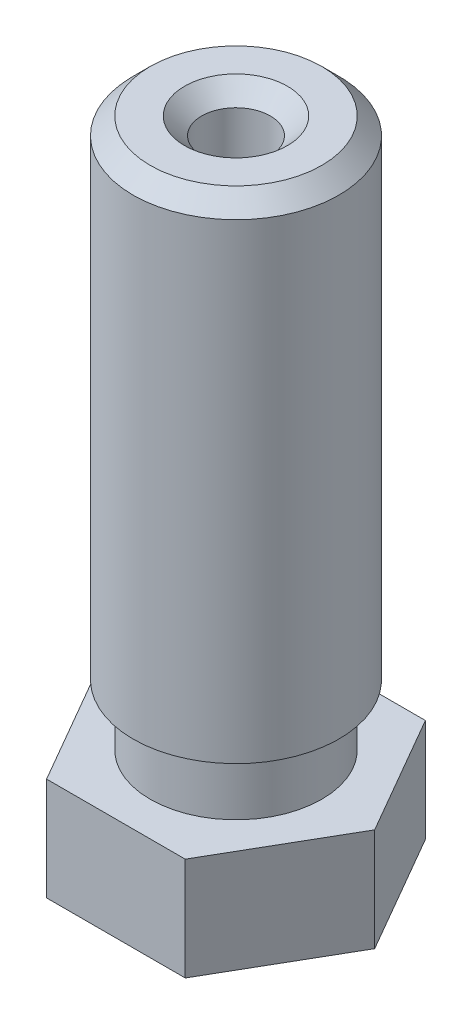
ISO-10303-21;
HEADER;
FILE_DESCRIPTION(('STEP AP214'),'2;1');
FILE_NAME('part.step','',(''),(''),'','','');
FILE_SCHEMA(('AUTOMOTIVE_DESIGN { 1 0 10303 214 1 1 1 1 }'));
ENDSEC;
DATA;
#1=APPLICATION_CONTEXT('core data for automotive mechanical design processes');
#2=APPLICATION_PROTOCOL_DEFINITION('international standard','automotive_design',2000,#1);
#3=PRODUCT_CONTEXT('',#1,'mechanical');
#4=PRODUCT('Part','Part','',(#3));
#5=PRODUCT_RELATED_PRODUCT_CATEGORY('part','',(#4));
#6=PRODUCT_DEFINITION_FORMATION('','',#4);
#7=PRODUCT_DEFINITION_CONTEXT('part definition',#1,'design');
#8=PRODUCT_DEFINITION('design','',#6,#7);
#9=PRODUCT_DEFINITION_SHAPE('','',#8);
#10=(LENGTH_UNIT() NAMED_UNIT(*) SI_UNIT(.MILLI.,.METRE.));
#11=(NAMED_UNIT(*) PLANE_ANGLE_UNIT() SI_UNIT($,.RADIAN.));
#12=(NAMED_UNIT(*) SI_UNIT($,.STERADIAN.) SOLID_ANGLE_UNIT());
#13=UNCERTAINTY_MEASURE_WITH_UNIT(LENGTH_MEASURE(1.E-05),#10,'distance_accuracy_value','');
#14=(GEOMETRIC_REPRESENTATION_CONTEXT(3) GLOBAL_UNCERTAINTY_ASSIGNED_CONTEXT((#13)) GLOBAL_UNIT_ASSIGNED_CONTEXT((#10,
#11,#12)) REPRESENTATION_CONTEXT('',''));
#15=CARTESIAN_POINT('',(0.,0.,0.));
#16=DIRECTION('',(0.,0.,1.));
#17=DIRECTION('',(1.,0.,0.));
#18=AXIS2_PLACEMENT_3D('',#15,#16,#17);
#19=CARTESIAN_POINT('',(0.,21.,0.));
#20=DIRECTION('',(0.,1.,0.));
#21=DIRECTION('',(0.,0.,1.));
#22=AXIS2_PLACEMENT_3D('',#19,#20,#21);
#23=PLANE('',#22);
#24=CARTESIAN_POINT('',(0.,21.,0.));
#25=DIRECTION('',(0.,1.,0.));
#26=DIRECTION('',(0.,0.,1.));
#27=AXIS2_PLACEMENT_3D('',#24,#25,#26);
#28=CIRCLE('',#27,2.5);
#29=CARTESIAN_POINT('',(0.,21.,2.5));
#30=VERTEX_POINT('',#29);
#31=EDGE_CURVE('E41',#30,#30,#28,.T.);
#32=ORIENTED_EDGE('',*,*,#31,.T.);
#33=EDGE_LOOP('',(#32));
#34=FACE_BOUND('',#33,.T.);
#35=CARTESIAN_POINT('',(0.,21.,0.));
#36=DIRECTION('',(0.,1.,0.));
#37=DIRECTION('',(0.,0.,1.));
#38=AXIS2_PLACEMENT_3D('',#35,#36,#37);
#39=CIRCLE('',#38,1.5);
#40=CARTESIAN_POINT('',(0.,21.,1.5));
#41=VERTEX_POINT('',#40);
#42=EDGE_CURVE('E125',#41,#41,#39,.F.);
#43=ORIENTED_EDGE('',*,*,#42,.T.);
#44=EDGE_LOOP('',(#43));
#45=FACE_BOUND('',#44,.T.);
#46=ADVANCED_FACE('F33',(#34,#45),#23,.T.);
#47=CARTESIAN_POINT('',(0.,0.,0.));
#48=DIRECTION('',(0.,1.,0.));
#49=DIRECTION('',(0.,0.,1.));
#50=AXIS2_PLACEMENT_3D('',#47,#48,#49);
#51=PLANE('',#50);
#52=CARTESIAN_POINT('',(0.,0.,0.));
#53=DIRECTION('',(0.,1.,0.));
#54=DIRECTION('',(0.,0.,1.));
#55=AXIS2_PLACEMENT_3D('',#52,#53,#54);
#56=CIRCLE('',#55,0.199999999999997);
#57=CARTESIAN_POINT('',(0.,0.,0.199999999999997));
#58=VERTEX_POINT('',#57);
#59=EDGE_CURVE('E110',#58,#58,#56,.T.);
#60=ORIENTED_EDGE('',*,*,#59,.T.);
#61=EDGE_LOOP('',(#60));
#62=FACE_BOUND('',#61,.T.);
#63=CARTESIAN_POINT('',(0.,0.,0.));
#64=DIRECTION('',(0.,1.,0.));
#65=DIRECTION('',(0.,0.,1.));
#66=AXIS2_PLACEMENT_3D('',#63,#64,#65);
#67=CIRCLE('',#66,0.499999999999997);
#68=CARTESIAN_POINT('',(0.,0.,0.499999999999997));
#69=VERTEX_POINT('',#68);
#70=EDGE_CURVE('E261',#69,#69,#67,.T.);
#71=ORIENTED_EDGE('',*,*,#70,.F.);
#72=EDGE_LOOP('',(#71));
#73=FACE_BOUND('',#72,.T.);
#74=ADVANCED_FACE('F183',(#62,#73),#51,.F.);
#75=CARTESIAN_POINT('',(0.,22.1265111624693,0.));
#76=DIRECTION('',(0.,1.,0.));
#77=DIRECTION('',(0.,0.,1.));
#78=AXIS2_PLACEMENT_3D('',#75,#76,#77);
#79=CYLINDRICAL_SURFACE('',#78,0.199999999999997);
#80=ORIENTED_EDGE('',*,*,#59,.F.);
#81=EDGE_LOOP('',(#80));
#82=FACE_BOUND('',#81,.T.);
#83=CARTESIAN_POINT('',(0.,0.6,0.));
#84=DIRECTION('',(0.,1.,0.));
#85=DIRECTION('',(0.,0.,1.));
#86=AXIS2_PLACEMENT_3D('',#83,#84,#85);
#87=CIRCLE('',#86,0.199999999999997);
#88=CARTESIAN_POINT('',(0.,0.6,0.199999999999997));
#89=VERTEX_POINT('',#88);
#90=EDGE_CURVE('E178',#89,#89,#87,.T.);
#91=ORIENTED_EDGE('',*,*,#90,.T.);
#92=EDGE_LOOP('',(#91));
#93=FACE_BOUND('',#92,.T.);
#94=ADVANCED_FACE('F186',(#82,#93),#79,.F.);
#95=CARTESIAN_POINT('',(0.,1.98564064605509,0.));
#96=DIRECTION('',(0.,1.,0.));
#97=DIRECTION('',(0.,0.,1.));
#98=AXIS2_PLACEMENT_3D('',#95,#96,#97);
#99=CONICAL_SURFACE('',#98,0.999999999999998,0.523598775598303);
#100=CARTESIAN_POINT('',(0.,1.98564064605509,0.));
#101=DIRECTION('',(0.,1.,0.));
#102=DIRECTION('',(0.,0.,1.));
#103=AXIS2_PLACEMENT_3D('',#100,#101,#102);
#104=CIRCLE('',#103,0.999999999999998);
#105=CARTESIAN_POINT('',(0.,1.98564064605509,0.999999999999997));
#106=VERTEX_POINT('',#105);
#107=EDGE_CURVE('E175',#106,#106,#104,.T.);
#108=CARTESIAN_POINT('',(0.,0.6,0.199999999999997));
#109=CARTESIAN_POINT('',(0.,0.61443375672974,0.208333333333331));
#110=CARTESIAN_POINT('',(0.,0.628867513459481,0.216666666666664));
#111=CARTESIAN_POINT('',(0.,0.657735026918962,0.233333333333331));
#112=CARTESIAN_POINT('',(0.,0.672168783648702,0.241666666666664));
#113=CARTESIAN_POINT('',(0.,0.701036297108183,0.258333333333331));
#114=CARTESIAN_POINT('',(0.,0.715470053837924,0.266666666666664));
#115=CARTESIAN_POINT('',(0.,0.744337567297405,0.283333333333331));
#116=CARTESIAN_POINT('',(0.,0.758771324027145,0.291666666666664));
#117=CARTESIAN_POINT('',(0.,0.787638837486626,0.308333333333331));
#118=CARTESIAN_POINT('',(0.,0.802072594216367,0.316666666666664));
#119=CARTESIAN_POINT('',(0.,0.830940107675848,0.333333333333331));
#120=CARTESIAN_POINT('',(0.,0.845373864405588,0.341666666666664));
#121=CARTESIAN_POINT('',(0.,0.874241377865069,0.358333333333331));
#122=CARTESIAN_POINT('',(0.,0.88867513459481,0.366666666666664));
#123=CARTESIAN_POINT('',(0.,0.917542648054291,0.383333333333331));
#124=CARTESIAN_POINT('',(0.,0.931976404784031,0.391666666666664));
#125=CARTESIAN_POINT('',(0.,0.960843918243512,0.408333333333331));
#126=CARTESIAN_POINT('',(0.,0.975277674973253,0.416666666666664));
#127=CARTESIAN_POINT('',(0.,1.00414518843273,0.433333333333331));
#128=CARTESIAN_POINT('',(0.,1.01857894516247,0.441666666666664));
#129=CARTESIAN_POINT('',(0.,1.04744645862196,0.458333333333331));
#130=CARTESIAN_POINT('',(0.,1.0618802153517,0.466666666666664));
#131=CARTESIAN_POINT('',(0.,1.09074772881118,0.483333333333331));
#132=CARTESIAN_POINT('',(0.,1.10518148554092,0.491666666666664));
#133=CARTESIAN_POINT('',(0.,1.1340489990004,0.508333333333331));
#134=CARTESIAN_POINT('',(0.,1.14848275573014,0.516666666666664));
#135=CARTESIAN_POINT('',(0.,1.17735026918962,0.533333333333331));
#136=CARTESIAN_POINT('',(0.,1.19178402591936,0.541666666666664));
#137=CARTESIAN_POINT('',(0.,1.22065153937884,0.558333333333331));
#138=CARTESIAN_POINT('',(0.,1.23508529610858,0.566666666666664));
#139=CARTESIAN_POINT('',(0.,1.26395280956806,0.583333333333331));
#140=CARTESIAN_POINT('',(0.,1.2783865662978,0.591666666666664));
#141=CARTESIAN_POINT('',(0.,1.30725407975728,0.608333333333331));
#142=CARTESIAN_POINT('',(0.,1.32168783648703,0.616666666666664));
#143=CARTESIAN_POINT('',(0.,1.35055534994651,0.633333333333331));
#144=CARTESIAN_POINT('',(0.,1.36498910667625,0.641666666666664));
#145=CARTESIAN_POINT('',(0.,1.39385662013573,0.658333333333331));
#146=CARTESIAN_POINT('',(0.,1.40829037686547,0.666666666666664));
#147=CARTESIAN_POINT('',(0.,1.43715789032495,0.683333333333331));
#148=CARTESIAN_POINT('',(0.,1.45159164705469,0.691666666666664));
#149=CARTESIAN_POINT('',(0.,1.48045916051417,0.708333333333331));
#150=CARTESIAN_POINT('',(0.,1.49489291724391,0.716666666666664));
#151=CARTESIAN_POINT('',(0.,1.52376043070339,0.733333333333331));
#152=CARTESIAN_POINT('',(0.,1.53819418743313,0.741666666666664));
#153=CARTESIAN_POINT('',(0.,1.56706170089261,0.758333333333331));
#154=CARTESIAN_POINT('',(0.,1.58149545762235,0.766666666666664));
#155=CARTESIAN_POINT('',(0.,1.61036297108183,0.783333333333331));
#156=CARTESIAN_POINT('',(0.,1.62479672781158,0.791666666666664));
#157=CARTESIAN_POINT('',(0.,1.65366424127106,0.808333333333331));
#158=CARTESIAN_POINT('',(0.,1.6680979980008,0.816666666666664));
#159=CARTESIAN_POINT('',(0.,1.69696551146028,0.833333333333331));
#160=CARTESIAN_POINT('',(0.,1.71139926819002,0.841666666666664));
#161=CARTESIAN_POINT('',(0.,1.7402667816495,0.858333333333331));
#162=CARTESIAN_POINT('',(0.,1.75470053837924,0.866666666666664));
#163=CARTESIAN_POINT('',(0.,1.78356805183872,0.883333333333331));
#164=CARTESIAN_POINT('',(0.,1.79800180856846,0.891666666666664));
#165=CARTESIAN_POINT('',(0.,1.82686932202794,0.908333333333331));
#166=CARTESIAN_POINT('',(0.,1.84130307875768,0.916666666666664));
#167=CARTESIAN_POINT('',(0.,1.87017059221716,0.933333333333331));
#168=CARTESIAN_POINT('',(0.,1.8846043489469,0.941666666666664));
#169=CARTESIAN_POINT('',(0.,1.91347186240639,0.958333333333331));
#170=CARTESIAN_POINT('',(0.,1.92790561913613,0.966666666666664));
#171=CARTESIAN_POINT('',(0.,1.95677313259561,0.983333333333331));
#172=CARTESIAN_POINT('',(0.,1.97120688932535,0.991666666666664));
#173=CARTESIAN_POINT('',(0.,1.98564064605509,0.999999999999997));
#174=B_SPLINE_CURVE_WITH_KNOTS('',3,(#108,#109,#110,#111,#112,#113,#114,#115,#116,#117,#118,
#119,#120,#121,#122,#123,#124,#125,#126,#127,#128,#129,#130,#131,#132,#133,#134,#135,#136,#137,
#138,#139,#140,#141,#142,#143,#144,#145,#146,#147,#148,#149,#150,#151,#152,#153,#154,#155,#156,
#157,#158,#159,#160,#161,#162,#163,#164,#165,#166,#167,#168,#169,#170,#171,#172,#173),
.UNSPECIFIED.,.F.,.F.,(4,2,2,2,2,2,2,2,2,2,2,2,2,2,2,2,2,2,2,2,2,2,2,2,2,2,2,2,2,2,2,2,4),(0.,
0.0499999999999995,0.0999999999999993,0.149999999999999,0.199999999999999,0.249999999999998,
0.299999999999998,0.349999999999997,0.399999999999997,0.449999999999997,0.499999999999996,
0.549999999999996,0.599999999999996,0.649999999999995,0.699999999999995,0.749999999999994,
0.799999999999994,0.849999999999994,0.899999999999993,0.949999999999993,0.999999999999993,
1.04999999999999,1.09999999999999,1.14999999999999,1.19999999999999,1.24999999999999,
1.29999999999999,1.34999999999999,1.39999999999999,1.44999999999999,1.49999999999999,
1.54999999999999,1.59999999999999),.UNSPECIFIED.);
#175=EDGE_CURVE('BSEAM189',#89,#106,#174,.T.);
#176=ORIENTED_EDGE('',*,*,#90,.F.);
#177=ORIENTED_EDGE('',*,*,#107,.T.);
#178=ORIENTED_EDGE('',*,*,#175,.T.);
#179=ORIENTED_EDGE('',*,*,#175,.F.);
#180=EDGE_LOOP('',(#176,#178,#177,#179));
#181=FACE_BOUND('',#180,.T.);
#182=ADVANCED_FACE('F189',(#181),#99,.F.);
#183=CARTESIAN_POINT('',(0.,22.1265111624693,0.));
#184=DIRECTION('',(0.,1.,0.));
#185=DIRECTION('',(0.,0.,1.));
#186=AXIS2_PLACEMENT_3D('',#183,#184,#185);
#187=CYLINDRICAL_SURFACE('',#186,0.999999999999998);
#188=CARTESIAN_POINT('',(0.,20.5,0.));
#189=DIRECTION('',(0.,1.,0.));
#190=DIRECTION('',(0.,0.,1.));
#191=AXIS2_PLACEMENT_3D('',#188,#189,#190);
#192=CIRCLE('',#191,0.999999999999998);
#193=CARTESIAN_POINT('',(0.,20.5,0.999999999999998));
#194=VERTEX_POINT('',#193);
#195=EDGE_CURVE('E11',#194,#194,#192,.T.);
#196=ORIENTED_EDGE('',*,*,#195,.T.);
#197=EDGE_LOOP('',(#196));
#198=FACE_BOUND('',#197,.T.);
#199=ORIENTED_EDGE('',*,*,#107,.F.);
#200=EDGE_LOOP('',(#199));
#201=FACE_BOUND('',#200,.T.);
#202=ADVANCED_FACE('F195',(#198,#201),#187,.F.);
#203=CARTESIAN_POINT('',(0.,0.,0.));
#204=DIRECTION('',(0.,1.,0.));
#205=DIRECTION('',(0.,0.,1.));
#206=AXIS2_PLACEMENT_3D('',#203,#204,#205);
#207=CONICAL_SURFACE('',#206,0.499999999999997,0.523598775598304);
#208=CARTESIAN_POINT('',(0.,2.,0.));
#209=DIRECTION('',(0.,1.,0.));
#210=DIRECTION('',(0.,0.,1.));
#211=AXIS2_PLACEMENT_3D('',#208,#209,#210);
#212=CIRCLE('',#211,1.65470053837926);
#213=CARTESIAN_POINT('',(0.,2.,1.65470053837926));
#214=VERTEX_POINT('',#213);
#215=EDGE_CURVE('E259',#214,#214,#212,.T.);
#216=CARTESIAN_POINT('',(0.,2.,1.65470053837926));
#217=CARTESIAN_POINT('',(0.,1.97916666666667,1.64267240777115));
#218=CARTESIAN_POINT('',(0.,1.95833333333334,1.63064427716303));
#219=CARTESIAN_POINT('',(0.,1.91666666666667,1.60658801594679));
#220=CARTESIAN_POINT('',(0.,1.89583333333334,1.59455988533868));
#221=CARTESIAN_POINT('',(0.,1.85416666666667,1.57050362412244));
#222=CARTESIAN_POINT('',(0.,1.83333333333334,1.55847549351432));
#223=CARTESIAN_POINT('',(0.,1.79166666666667,1.53441923229809));
#224=CARTESIAN_POINT('',(0.,1.77083333333334,1.52239110168997));
#225=CARTESIAN_POINT('',(0.,1.72916666666667,1.49833484047374));
#226=CARTESIAN_POINT('',(0.,1.70833333333333,1.48630670986562));
#227=CARTESIAN_POINT('',(0.,1.66666666666667,1.46225044864939));
#228=CARTESIAN_POINT('',(0.,1.64583333333333,1.45022231804127));
#229=CARTESIAN_POINT('',(0.,1.60416666666667,1.42616605682503));
#230=CARTESIAN_POINT('',(0.,1.58333333333333,1.41413792621692));
#231=CARTESIAN_POINT('',(0.,1.54166666666667,1.39008166500068));
#232=CARTESIAN_POINT('',(0.,1.52083333333333,1.37805353439256));
#233=CARTESIAN_POINT('',(0.,1.47916666666667,1.35399727317633));
#234=CARTESIAN_POINT('',(0.,1.45833333333333,1.34196914256821));
#235=CARTESIAN_POINT('',(0.,1.41666666666667,1.31791288135198));
#236=CARTESIAN_POINT('',(0.,1.39583333333333,1.30588475074386));
#237=CARTESIAN_POINT('',(0.,1.35416666666667,1.28182848952763));
#238=CARTESIAN_POINT('',(0.,1.33333333333333,1.26980035891951));
#239=CARTESIAN_POINT('',(0.,1.29166666666667,1.24574409770327));
#240=CARTESIAN_POINT('',(0.,1.27083333333333,1.23371596709516));
#241=CARTESIAN_POINT('',(0.,1.22916666666667,1.20965970587892));
#242=CARTESIAN_POINT('',(0.,1.20833333333333,1.1976315752708));
#243=CARTESIAN_POINT('',(0.,1.16666666666667,1.17357531405457));
#244=CARTESIAN_POINT('',(0.,1.14583333333333,1.16154718344645));
#245=CARTESIAN_POINT('',(0.,1.10416666666667,1.13749092223022));
#246=CARTESIAN_POINT('',(0.,1.08333333333333,1.1254627916221));
#247=CARTESIAN_POINT('',(0.,1.04166666666667,1.10140653040586));
#248=CARTESIAN_POINT('',(0.,1.02083333333333,1.08937839979775));
#249=CARTESIAN_POINT('',(0.,0.979166666666668,1.06532213858151));
#250=CARTESIAN_POINT('',(0.,0.958333333333334,1.0532940079734));
#251=CARTESIAN_POINT('',(0.,0.916666666666668,1.02923774675716));
#252=CARTESIAN_POINT('',(0.,0.895833333333334,1.01720961614904));
#253=CARTESIAN_POINT('',(0.,0.854166666666667,0.993153354932809));
#254=CARTESIAN_POINT('',(0.,0.833333333333334,0.981125224324691));
#255=CARTESIAN_POINT('',(0.,0.791666666666667,0.957068963108457));
#256=CARTESIAN_POINT('',(0.,0.770833333333334,0.945040832500339));
#257=CARTESIAN_POINT('',(0.,0.729166666666667,0.920984571284105));
#258=CARTESIAN_POINT('',(0.,0.708333333333334,0.908956440675987));
#259=CARTESIAN_POINT('',(0.,0.666666666666667,0.884900179459753));
#260=CARTESIAN_POINT('',(0.,0.645833333333334,0.872872048851635));
#261=CARTESIAN_POINT('',(0.,0.604166666666667,0.848815787635401));
#262=CARTESIAN_POINT('',(0.,0.583333333333334,0.836787657027283));
#263=CARTESIAN_POINT('',(0.,0.541666666666667,0.812731395811048));
#264=CARTESIAN_POINT('',(0.,0.520833333333334,0.800703265202931));
#265=CARTESIAN_POINT('',(0.,0.479166666666667,0.776647003986696));
#266=CARTESIAN_POINT('',(0.,0.458333333333334,0.764618873378579));
#267=CARTESIAN_POINT('',(0.,0.416666666666667,0.740562612162344));
#268=CARTESIAN_POINT('',(0.,0.395833333333334,0.728534481554227));
#269=CARTESIAN_POINT('',(0.,0.354166666666667,0.704478220337992));
#270=CARTESIAN_POINT('',(0.,0.333333333333334,0.692450089729875));
#271=CARTESIAN_POINT('',(0.,0.291666666666667,0.66839382851364));
#272=CARTESIAN_POINT('',(0.,0.270833333333334,0.656365697905523));
#273=CARTESIAN_POINT('',(0.,0.229166666666667,0.632309436689288));
#274=CARTESIAN_POINT('',(0.,0.208333333333334,0.620281306081171));
#275=CARTESIAN_POINT('',(0.,0.166666666666667,0.596225044864936));
#276=CARTESIAN_POINT('',(0.,0.145833333333333,0.584196914256819));
#277=CARTESIAN_POINT('',(0.,0.104166666666667,0.560140653040584));
#278=CARTESIAN_POINT('',(0.,0.0833333333333334,0.548112522432467));
#279=CARTESIAN_POINT('',(0.,0.0416666666666667,0.524056261216232));
#280=CARTESIAN_POINT('',(0.,0.0208333333333334,0.512028130608115));
#281=CARTESIAN_POINT('',(0.,0.,0.499999999999997));
#282=B_SPLINE_CURVE_WITH_KNOTS('',3,(#216,#217,#218,#219,#220,#221,#222,#223,#224,#225,#226,
#227,#228,#229,#230,#231,#232,#233,#234,#235,#236,#237,#238,#239,#240,#241,#242,#243,#244,#245,
#246,#247,#248,#249,#250,#251,#252,#253,#254,#255,#256,#257,#258,#259,#260,#261,#262,#263,#264,
#265,#266,#267,#268,#269,#270,#271,#272,#273,#274,#275,#276,#277,#278,#279,#280,#281),
.UNSPECIFIED.,.F.,.F.,(4,2,2,2,2,2,2,2,2,2,2,2,2,2,2,2,2,2,2,2,2,2,2,2,2,2,2,2,2,2,2,2,4),(0.,
0.0721687836487035,0.144337567297407,0.216506350946111,0.288675134594814,0.360843918243518,
0.433012701892221,0.505181485540925,0.577350269189628,0.649519052838332,0.721687836487035,
0.793856620135739,0.866025403784442,0.938194187433146,1.01036297108185,1.08253175473055,
1.15470053837926,1.22686932202796,1.29903810567666,1.37120688932537,1.44337567297407,
1.51554445662277,1.58771324027148,1.65988202392018,1.73205080756888,1.80421959121759,
1.87638837486629,1.94855715851499,2.0207259421637,2.0928947258124,2.16506350946111,
2.23723229310981,2.30940107675851),.UNSPECIFIED.);
#283=EDGE_CURVE('BSEAM200',#214,#69,#282,.T.);
#284=ORIENTED_EDGE('',*,*,#215,.F.);
#285=ORIENTED_EDGE('',*,*,#70,.T.);
#286=ORIENTED_EDGE('',*,*,#283,.T.);
#287=ORIENTED_EDGE('',*,*,#283,.F.);
#288=EDGE_LOOP('',(#284,#286,#285,#287));
#289=FACE_BOUND('',#288,.T.);
#290=ADVANCED_FACE('F200',(#289),#207,.T.);
#291=CARTESIAN_POINT('',(-6.01219615617016,2.,0.));
#292=DIRECTION('',(0.,1.,0.));
#293=DIRECTION('',(0.,0.,1.));
#294=AXIS2_PLACEMENT_3D('',#291,#292,#293);
#295=PLANE('',#294);
#296=ORIENTED_EDGE('',*,*,#215,.T.);
#297=EDGE_LOOP('',(#296));
#298=FACE_BOUND('',#297,.T.);
#299=DIRECTION('',(1.,0.,0.));
#300=VECTOR('',#299,1.);
#301=CARTESIAN_POINT('',(-2.02072594216365,2.,3.50000000000001));
#302=LINE('',#301,#300);
#303=CARTESIAN_POINT('',(-2.02072594216365,2.,3.50000000000001));
#304=VERTEX_POINT('',#303);
#305=CARTESIAN_POINT('',(2.02072594216372,2.00000000000001,3.49999999999996));
#306=VERTEX_POINT('',#305);
#307=EDGE_CURVE('E83',#304,#306,#302,.T.);
#308=ORIENTED_EDGE('',*,*,#307,.F.);
#309=DIRECTION('',(0.500000000000007,0.,0.866025403784435));
#310=VECTOR('',#309,1.);
#311=CARTESIAN_POINT('',(-4.04145188432737,2.,0.));
#312=LINE('',#311,#310);
#313=CARTESIAN_POINT('',(-4.04145188432737,2.,0.));
#314=VERTEX_POINT('',#313);
#315=EDGE_CURVE('E86',#314,#304,#312,.T.);
#316=ORIENTED_EDGE('',*,*,#315,.F.);
#317=DIRECTION('',(-0.499999999999995,0.,0.866025403784442));
#318=VECTOR('',#317,1.);
#319=CARTESIAN_POINT('',(-2.0207259421637,2.,-3.49999999999998));
#320=LINE('',#319,#318);
#321=CARTESIAN_POINT('',(-2.0207259421637,2.,-3.49999999999998));
#322=VERTEX_POINT('',#321);
#323=EDGE_CURVE('E102',#322,#314,#320,.T.);
#324=ORIENTED_EDGE('',*,*,#323,.F.);
#325=DIRECTION('',(-1.,0.,0.));
#326=VECTOR('',#325,1.);
#327=CARTESIAN_POINT('',(2.02072594216367,2.,-3.49999999999999));
#328=LINE('',#327,#326);
#329=CARTESIAN_POINT('',(2.02072594216367,2.,-3.49999999999999));
#330=VERTEX_POINT('',#329);
#331=EDGE_CURVE('E155',#330,#322,#328,.T.);
#332=ORIENTED_EDGE('',*,*,#331,.F.);
#333=DIRECTION('',(-0.500000000000001,0.,-0.866025403784438));
#334=VECTOR('',#333,1.);
#335=CARTESIAN_POINT('',(4.04145188432737,2.,0.));
#336=LINE('',#335,#334);
#337=CARTESIAN_POINT('',(4.04145188432737,2.,0.));
#338=VERTEX_POINT('',#337);
#339=EDGE_CURVE('E158',#338,#330,#336,.T.);
#340=ORIENTED_EDGE('',*,*,#339,.F.);
#341=DIRECTION('',(0.499999999999995,0.,-0.866025403784442));
#342=VECTOR('',#341,1.);
#343=CARTESIAN_POINT('',(2.02072594216372,2.,3.49999999999996));
#344=LINE('',#343,#342);
#345=EDGE_CURVE('E56',#306,#338,#344,.T.);
#346=ORIENTED_EDGE('',*,*,#345,.F.);
#347=EDGE_LOOP('',(#308,#316,#324,#332,#340,#346));
#348=FACE_BOUND('',#347,.T.);
#349=ADVANCED_FACE('F85',(#298,#348),#295,.F.);
#350=CARTESIAN_POINT('',(-2.5,5.,0.));
#351=DIRECTION('',(0.,-1.,0.));
#352=DIRECTION('',(0.,0.,-1.));
#353=AXIS2_PLACEMENT_3D('',#350,#351,#352);
#354=PLANE('',#353);
#355=CARTESIAN_POINT('',(0.,5.,0.));
#356=DIRECTION('',(0.,1.,0.));
#357=DIRECTION('',(0.,0.,1.));
#358=AXIS2_PLACEMENT_3D('',#355,#356,#357);
#359=CIRCLE('',#358,2.5);
#360=CARTESIAN_POINT('',(0.,5.,2.5));
#361=VERTEX_POINT('',#360);
#362=EDGE_CURVE('E150',#361,#361,#359,.T.);
#363=ORIENTED_EDGE('',*,*,#362,.F.);
#364=EDGE_LOOP('',(#363));
#365=FACE_BOUND('',#364,.T.);
#366=DIRECTION('',(0.500000000000001,0.,0.866025403784438));
#367=VECTOR('',#366,1.);
#368=CARTESIAN_POINT('',(4.04145188432737,5.,0.));
#369=LINE('',#368,#367);
#370=CARTESIAN_POINT('',(2.02072594216367,5.,-3.49999999999999));
#371=VERTEX_POINT('',#370);
#372=CARTESIAN_POINT('',(4.04145188432737,5.,0.));
#373=VERTEX_POINT('',#372);
#374=EDGE_CURVE('E169',#371,#373,#369,.T.);
#375=ORIENTED_EDGE('',*,*,#374,.F.);
#376=DIRECTION('',(1.,0.,0.));
#377=VECTOR('',#376,1.);
#378=CARTESIAN_POINT('',(2.02072594216367,5.,-3.49999999999999));
#379=LINE('',#378,#377);
#380=CARTESIAN_POINT('',(-2.0207259421637,5.,-3.49999999999998));
#381=VERTEX_POINT('',#380);
#382=EDGE_CURVE('E166',#381,#371,#379,.T.);
#383=ORIENTED_EDGE('',*,*,#382,.F.);
#384=DIRECTION('',(0.499999999999995,0.,-0.866025403784442));
#385=VECTOR('',#384,1.);
#386=CARTESIAN_POINT('',(-2.0207259421637,5.,-3.49999999999998));
#387=LINE('',#386,#385);
#388=CARTESIAN_POINT('',(-4.04145188432737,5.,0.));
#389=VERTEX_POINT('',#388);
#390=EDGE_CURVE('E163',#389,#381,#387,.T.);
#391=ORIENTED_EDGE('',*,*,#390,.F.);
#392=DIRECTION('',(-0.500000000000007,0.,-0.866025403784435));
#393=VECTOR('',#392,1.);
#394=CARTESIAN_POINT('',(-4.04145188432737,5.,0.));
#395=LINE('',#394,#393);
#396=CARTESIAN_POINT('',(-2.02072594216365,5.00000000000001,3.50000000000001));
#397=VERTEX_POINT('',#396);
#398=EDGE_CURVE('E48',#397,#389,#395,.T.);
#399=ORIENTED_EDGE('',*,*,#398,.F.);
#400=DIRECTION('',(-1.,0.,0.));
#401=VECTOR('',#400,1.);
#402=CARTESIAN_POINT('',(-2.02072594216365,5.,3.50000000000001));
#403=LINE('',#402,#401);
#404=CARTESIAN_POINT('',(2.02072594216372,5.,3.49999999999996));
#405=VERTEX_POINT('',#404);
#406=EDGE_CURVE('E92',#405,#397,#403,.T.);
#407=ORIENTED_EDGE('',*,*,#406,.F.);
#408=DIRECTION('',(-0.499999999999995,0.,0.866025403784442));
#409=VECTOR('',#408,1.);
#410=CARTESIAN_POINT('',(2.02072594216372,5.,3.49999999999996));
#411=LINE('',#410,#409);
#412=EDGE_CURVE('E172',#373,#405,#411,.T.);
#413=ORIENTED_EDGE('',*,*,#412,.F.);
#414=EDGE_LOOP('',(#375,#383,#391,#399,#407,#413));
#415=FACE_BOUND('',#414,.T.);
#416=ADVANCED_FACE('F142',(#365,#415),#354,.F.);
#417=CARTESIAN_POINT('',(0.,22.1265111624693,0.));
#418=DIRECTION('',(0.,1.,0.));
#419=DIRECTION('',(0.,0.,1.));
#420=AXIS2_PLACEMENT_3D('',#417,#418,#419);
#421=CYLINDRICAL_SURFACE('',#420,3.);
#422=CARTESIAN_POINT('',(0.,20.5,0.));
#423=DIRECTION('',(0.,1.,0.));
#424=DIRECTION('',(0.,0.,1.));
#425=AXIS2_PLACEMENT_3D('',#422,#423,#424);
#426=CIRCLE('',#425,3.);
#427=CARTESIAN_POINT('',(0.,20.5,3.));
#428=VERTEX_POINT('',#427);
#429=EDGE_CURVE('E122',#428,#428,#426,.F.);
#430=ORIENTED_EDGE('',*,*,#429,.T.);
#431=EDGE_LOOP('',(#430));
#432=FACE_BOUND('',#431,.T.);
#433=CARTESIAN_POINT('',(0.,6.77056695580631,0.));
#434=DIRECTION('',(0.,1.,0.));
#435=DIRECTION('',(0.,0.,1.));
#436=AXIS2_PLACEMENT_3D('',#433,#434,#435);
#437=CIRCLE('',#436,3.);
#438=CARTESIAN_POINT('',(0.,6.77056695580631,3.));
#439=VERTEX_POINT('',#438);
#440=EDGE_CURVE('E103',#439,#439,#437,.T.);
#441=ORIENTED_EDGE('',*,*,#440,.T.);
#442=EDGE_LOOP('',(#441));
#443=FACE_BOUND('',#442,.T.);
#444=ADVANCED_FACE('F138',(#432,#443),#421,.T.);
#445=CARTESIAN_POINT('',(0.,6.5,0.));
#446=DIRECTION('',(0.,1.,0.));
#447=DIRECTION('',(0.,0.,1.));
#448=AXIS2_PLACEMENT_3D('',#445,#446,#447);
#449=CONICAL_SURFACE('',#448,2.5,1.07478556718223);
#450=ORIENTED_EDGE('',*,*,#440,.F.);
#451=EDGE_LOOP('',(#450));
#452=FACE_BOUND('',#451,.T.);
#453=CARTESIAN_POINT('',(0.,6.5,0.));
#454=DIRECTION('',(0.,1.,0.));
#455=DIRECTION('',(0.,0.,1.));
#456=AXIS2_PLACEMENT_3D('',#453,#454,#455);
#457=CIRCLE('',#456,2.5);
#458=CARTESIAN_POINT('',(0.,6.5,2.5));
#459=VERTEX_POINT('',#458);
#460=EDGE_CURVE('E147',#459,#459,#457,.T.);
#461=ORIENTED_EDGE('',*,*,#460,.T.);
#462=EDGE_LOOP('',(#461));
#463=FACE_BOUND('',#462,.T.);
#464=ADVANCED_FACE('F141',(#452,#463),#449,.T.);
#465=CARTESIAN_POINT('',(0.,22.1265111624693,0.));
#466=DIRECTION('',(0.,1.,0.));
#467=DIRECTION('',(0.,0.,1.));
#468=AXIS2_PLACEMENT_3D('',#465,#466,#467);
#469=CYLINDRICAL_SURFACE('',#468,2.5);
#470=ORIENTED_EDGE('',*,*,#460,.F.);
#471=EDGE_LOOP('',(#470));
#472=FACE_BOUND('',#471,.T.);
#473=ORIENTED_EDGE('',*,*,#362,.T.);
#474=EDGE_LOOP('',(#473));
#475=FACE_BOUND('',#474,.T.);
#476=ADVANCED_FACE('F217',(#472,#475),#469,.T.);
#477=CARTESIAN_POINT('',(-2.02072594216365,21.,3.50000000000001));
#478=DIRECTION('',(0.,0.,-1.));
#479=DIRECTION('',(-1.,0.,0.));
#480=AXIS2_PLACEMENT_3D('',#477,#478,#479);
#481=PLANE('',#480);
#482=DIRECTION('',(0.,-1.,0.));
#483=VECTOR('',#482,1.);
#484=CARTESIAN_POINT('',(2.02072594216372,21.,3.49999999999996));
#485=LINE('',#484,#483);
#486=EDGE_CURVE('E106',#405,#306,#485,.T.);
#487=ORIENTED_EDGE('',*,*,#486,.F.);
#488=ORIENTED_EDGE('',*,*,#406,.T.);
#489=DIRECTION('',(0.,-1.,0.));
#490=VECTOR('',#489,1.);
#491=CARTESIAN_POINT('',(-2.02072594216365,21.,3.50000000000001));
#492=LINE('',#491,#490);
#493=EDGE_CURVE('E99',#397,#304,#492,.T.);
#494=ORIENTED_EDGE('',*,*,#493,.T.);
#495=ORIENTED_EDGE('',*,*,#307,.T.);
#496=EDGE_LOOP('',(#487,#488,#494,#495));
#497=FACE_BOUND('',#496,.T.);
#498=ADVANCED_FACE('F105',(#497),#481,.F.);
#499=CARTESIAN_POINT('',(-4.04145188432737,21.,0.));
#500=DIRECTION('',(0.866025403784435,0.,-0.500000000000007));
#501=DIRECTION('',(-0.500000000000007,0.,-0.866025403784435));
#502=AXIS2_PLACEMENT_3D('',#499,#500,#501);
#503=PLANE('',#502);
#504=ORIENTED_EDGE('',*,*,#493,.F.);
#505=ORIENTED_EDGE('',*,*,#398,.T.);
#506=DIRECTION('',(0.,-1.,0.));
#507=VECTOR('',#506,1.);
#508=CARTESIAN_POINT('',(-4.04145188432737,21.,0.));
#509=LINE('',#508,#507);
#510=EDGE_CURVE('E101',#389,#314,#509,.T.);
#511=ORIENTED_EDGE('',*,*,#510,.T.);
#512=ORIENTED_EDGE('',*,*,#315,.T.);
#513=EDGE_LOOP('',(#504,#505,#511,#512));
#514=FACE_BOUND('',#513,.T.);
#515=ADVANCED_FACE('F98',(#514),#503,.F.);
#516=CARTESIAN_POINT('',(-2.0207259421637,21.,-3.49999999999998));
#517=DIRECTION('',(0.866025403784442,0.,0.499999999999995));
#518=DIRECTION('',(0.499999999999995,0.,-0.866025403784442));
#519=AXIS2_PLACEMENT_3D('',#516,#517,#518);
#520=PLANE('',#519);
#521=ORIENTED_EDGE('',*,*,#510,.F.);
#522=ORIENTED_EDGE('',*,*,#390,.T.);
#523=DIRECTION('',(0.,-1.,0.));
#524=VECTOR('',#523,1.);
#525=CARTESIAN_POINT('',(-2.0207259421637,21.,-3.49999999999998));
#526=LINE('',#525,#524);
#527=EDGE_CURVE('E108',#381,#322,#526,.T.);
#528=ORIENTED_EDGE('',*,*,#527,.T.);
#529=ORIENTED_EDGE('',*,*,#323,.T.);
#530=EDGE_LOOP('',(#521,#522,#528,#529));
#531=FACE_BOUND('',#530,.T.);
#532=ADVANCED_FACE('F220',(#531),#520,.F.);
#533=CARTESIAN_POINT('',(2.02072594216367,21.,-3.49999999999999));
#534=DIRECTION('',(0.,0.,1.));
#535=DIRECTION('',(1.,0.,0.));
#536=AXIS2_PLACEMENT_3D('',#533,#534,#535);
#537=PLANE('',#536);
#538=ORIENTED_EDGE('',*,*,#527,.F.);
#539=ORIENTED_EDGE('',*,*,#382,.T.);
#540=DIRECTION('',(0.,-1.,0.));
#541=VECTOR('',#540,1.);
#542=CARTESIAN_POINT('',(2.02072594216367,21.,-3.49999999999999));
#543=LINE('',#542,#541);
#544=EDGE_CURVE('E116',#371,#330,#543,.T.);
#545=ORIENTED_EDGE('',*,*,#544,.T.);
#546=ORIENTED_EDGE('',*,*,#331,.T.);
#547=EDGE_LOOP('',(#538,#539,#545,#546));
#548=FACE_BOUND('',#547,.T.);
#549=ADVANCED_FACE('F223',(#548),#537,.F.);
#550=CARTESIAN_POINT('',(4.04145188432737,21.,0.));
#551=DIRECTION('',(-0.866025403784438,0.,0.500000000000001));
#552=DIRECTION('',(0.500000000000001,0.,0.866025403784438));
#553=AXIS2_PLACEMENT_3D('',#550,#551,#552);
#554=PLANE('',#553);
#555=ORIENTED_EDGE('',*,*,#544,.F.);
#556=ORIENTED_EDGE('',*,*,#374,.T.);
#557=DIRECTION('',(0.,-1.,0.));
#558=VECTOR('',#557,1.);
#559=CARTESIAN_POINT('',(4.04145188432737,21.,0.));
#560=LINE('',#559,#558);
#561=EDGE_CURVE('E93',#373,#338,#560,.T.);
#562=ORIENTED_EDGE('',*,*,#561,.T.);
#563=ORIENTED_EDGE('',*,*,#339,.T.);
#564=EDGE_LOOP('',(#555,#556,#562,#563));
#565=FACE_BOUND('',#564,.T.);
#566=ADVANCED_FACE('F227',(#565),#554,.F.);
#567=CARTESIAN_POINT('',(2.02072594216372,21.,3.49999999999996));
#568=DIRECTION('',(-0.866025403784442,0.,-0.499999999999995));
#569=DIRECTION('',(-0.499999999999995,0.,0.866025403784442));
#570=AXIS2_PLACEMENT_3D('',#567,#568,#569);
#571=PLANE('',#570);
#572=ORIENTED_EDGE('',*,*,#561,.F.);
#573=ORIENTED_EDGE('',*,*,#412,.T.);
#574=ORIENTED_EDGE('',*,*,#486,.T.);
#575=ORIENTED_EDGE('',*,*,#345,.T.);
#576=EDGE_LOOP('',(#572,#573,#574,#575));
#577=FACE_BOUND('',#576,.T.);
#578=ADVANCED_FACE('F135',(#577),#571,.F.);
#579=CARTESIAN_POINT('',(0.,20.5,0.));
#580=DIRECTION('',(0.,-1.,0.));
#581=DIRECTION('',(0.,0.,-1.));
#582=AXIS2_PLACEMENT_3D('',#579,#580,#581);
#583=CONICAL_SURFACE('',#582,3.,0.785398163397456);
#584=ORIENTED_EDGE('',*,*,#31,.F.);
#585=EDGE_LOOP('',(#584));
#586=FACE_BOUND('',#585,.T.);
#587=ORIENTED_EDGE('',*,*,#429,.F.);
#588=EDGE_LOOP('',(#587));
#589=FACE_BOUND('',#588,.T.);
#590=ADVANCED_FACE('F132',(#586,#589),#583,.T.);
#591=CARTESIAN_POINT('',(0.,20.5,0.));
#592=DIRECTION('',(0.,1.,0.));
#593=DIRECTION('',(0.,0.,1.));
#594=AXIS2_PLACEMENT_3D('',#591,#592,#593);
#595=CONICAL_SURFACE('',#594,0.999999999999998,0.785398163397451);
#596=ORIENTED_EDGE('',*,*,#42,.F.);
#597=EDGE_LOOP('',(#596));
#598=FACE_BOUND('',#597,.T.);
#599=ORIENTED_EDGE('',*,*,#195,.F.);
#600=EDGE_LOOP('',(#599));
#601=FACE_BOUND('',#600,.T.);
#602=ADVANCED_FACE('F35',(#598,#601),#595,.F.);
#603=CLOSED_SHELL('',(#46,#74,#94,#182,#202,#290,#349,#416,#444,#464,#476,#498,#515,#532,#549,
#566,#578,#590,#602));
#604=MANIFOLD_SOLID_BREP('B2',#603);
#605=ADVANCED_BREP_SHAPE_REPRESENTATION('',(#18,#604),#14);
#606=SHAPE_DEFINITION_REPRESENTATION(#9,#605);
ENDSEC;
END-ISO-10303-21;
